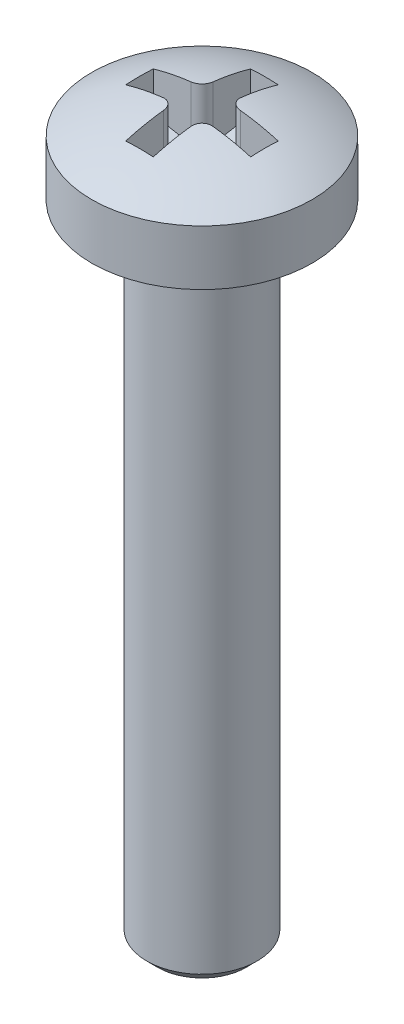
ISO-10303-21;
HEADER;
FILE_DESCRIPTION(('STEP AP214'),'2;1');
FILE_NAME('part.step','',(''),(''),'','','');
FILE_SCHEMA(('AUTOMOTIVE_DESIGN { 1 0 10303 214 1 1 1 1 }'));
ENDSEC;
DATA;
#1=APPLICATION_CONTEXT('core data for automotive mechanical design processes');
#2=APPLICATION_PROTOCOL_DEFINITION('international standard','automotive_design',2000,#1);
#3=PRODUCT_CONTEXT('',#1,'mechanical');
#4=PRODUCT('Part','Part','',(#3));
#5=PRODUCT_RELATED_PRODUCT_CATEGORY('part','',(#4));
#6=PRODUCT_DEFINITION_FORMATION('','',#4);
#7=PRODUCT_DEFINITION_CONTEXT('part definition',#1,'design');
#8=PRODUCT_DEFINITION('design','',#6,#7);
#9=PRODUCT_DEFINITION_SHAPE('','',#8);
#10=(LENGTH_UNIT() NAMED_UNIT(*) SI_UNIT(.MILLI.,.METRE.));
#11=(NAMED_UNIT(*) PLANE_ANGLE_UNIT() SI_UNIT($,.RADIAN.));
#12=(NAMED_UNIT(*) SI_UNIT($,.STERADIAN.) SOLID_ANGLE_UNIT());
#13=UNCERTAINTY_MEASURE_WITH_UNIT(LENGTH_MEASURE(1.E-05),#10,'distance_accuracy_value','');
#14=(GEOMETRIC_REPRESENTATION_CONTEXT(3) GLOBAL_UNCERTAINTY_ASSIGNED_CONTEXT((#13)) GLOBAL_UNIT_ASSIGNED_CONTEXT((#10,
#11,#12)) REPRESENTATION_CONTEXT('',''));
#15=CARTESIAN_POINT('',(0.,0.,0.));
#16=DIRECTION('',(0.,0.,1.));
#17=DIRECTION('',(1.,0.,0.));
#18=AXIS2_PLACEMENT_3D('',#15,#16,#17);
#19=CARTESIAN_POINT('',(3.,-35.,0.));
#20=DIRECTION('',(0.,1.,0.));
#21=DIRECTION('',(0.,0.,1.));
#22=AXIS2_PLACEMENT_3D('',#19,#20,#21);
#23=PLANE('',#22);
#24=CARTESIAN_POINT('',(0.,-35.,0.));
#25=DIRECTION('',(0.,1.,0.));
#26=DIRECTION('',(0.,0.,1.));
#27=AXIS2_PLACEMENT_3D('',#24,#25,#26);
#28=CIRCLE('',#27,2.40000000000001);
#29=CARTESIAN_POINT('',(0.,-35.,2.40000000000001));
#30=VERTEX_POINT('',#29);
#31=EDGE_CURVE('E11',#30,#30,#28,.F.);
#32=ORIENTED_EDGE('',*,*,#31,.T.);
#33=EDGE_LOOP('',(#32));
#34=FACE_BOUND('',#33,.T.);
#35=ADVANCED_FACE('F37',(#34),#23,.F.);
#36=CARTESIAN_POINT('',(0.,-7.44999999999999,0.));
#37=DIRECTION('',(0.,1.,0.));
#38=DIRECTION('',(1.,0.,0.));
#39=AXIS2_PLACEMENT_3D('',#36,#37,#38);
#40=SPHERICAL_SURFACE('',#39,12.05);
#41=CARTESIAN_POINT('',(0.75,-7.44999999999999,0.));
#42=DIRECTION('',(1.,0.,0.));
#43=DIRECTION('',(0.,0.,-1.));
#44=AXIS2_PLACEMENT_3D('',#41,#42,#43);
#45=CIRCLE('',#44,12.0266371026983);
#46=CARTESIAN_POINT('',(0.75,4.08603051313579,-3.4));
#47=VERTEX_POINT('',#46);
#48=CARTESIAN_POINT('',(0.75,4.50062759858243,-1.35));
#49=VERTEX_POINT('',#48);
#50=EDGE_CURVE('E195',#47,#49,#45,.T.);
#51=ORIENTED_EDGE('',*,*,#50,.T.);
#52=CARTESIAN_POINT('',(0.75,4.50062759858243,-1.35));
#53=CARTESIAN_POINT('',(0.749970698872697,4.50440889012492,-1.31655591255039));
#54=CARTESIAN_POINT('',(0.752794798026864,4.50786991911377,-1.28307795509376));
#55=CARTESIAN_POINT('',(0.763975275297831,4.51406552358367,-1.21700468922484));
#56=CARTESIAN_POINT('',(0.772329233355664,4.51680041611411,-1.18440900119309));
#57=CARTESIAN_POINT('',(0.79440353509289,4.52146303861642,-1.12099578071274));
#58=CARTESIAN_POINT('',(0.808127936309649,4.52339015600345,-1.09017961299683));
#59=CARTESIAN_POINT('',(0.840557266614517,4.52637706033217,-1.03125561276694));
#60=CARTESIAN_POINT('',(0.8592606546155,4.52743711523272,-1.00314694589195));
#61=CARTESIAN_POINT('',(0.900979469558403,4.52865432624304,-0.95062827208944));
#62=CARTESIAN_POINT('',(0.923964554523091,4.52881760325255,-0.926194301302964));
#63=CARTESIAN_POINT('',(0.973678414753883,4.52825275812473,-0.881492303520661));
#64=CARTESIAN_POINT('',(1.00040776840153,4.52752449813588,-0.861224921338421));
#65=CARTESIAN_POINT('',(1.05675110369052,4.52520195501556,-0.825485736308251));
#66=CARTESIAN_POINT('',(1.08635633111687,4.52361023640853,-0.809999944511885));
#67=CARTESIAN_POINT('',(1.14767285065154,4.51960909198419,-0.78416498760138));
#68=CARTESIAN_POINT('',(1.17938331676325,4.51719998536419,-0.773813821249108));
#69=CARTESIAN_POINT('',(1.23437039023693,4.51246564112583,-0.760785009950145));
#70=CARTESIAN_POINT('',(1.25734967707357,4.51032865006867,-0.756740661571654));
#71=CARTESIAN_POINT('',(1.30355584224305,4.50572101643025,-0.751347964421718));
#72=CARTESIAN_POINT('',(1.3267823190226,4.50325085589045,-0.749995764296765));
#73=CARTESIAN_POINT('',(1.35,4.50062759858243,-0.75));
#74=B_SPLINE_CURVE_WITH_KNOTS('',3,(#52,#53,#54,#55,#56,#57,#58,#59,#60,#61,#62,#63,#64,#65,#66,
#67,#68,#69,#70,#71,#72,#73),.UNSPECIFIED.,.F.,.F.,(4,2,2,2,2,2,2,2,2,2,4),(0.,
0.100848616189047,0.201653126662501,0.302533945598312,0.403383576314152,0.503544000910255,
0.603719914500104,0.703599915669478,0.803440957613562,0.873581021054327,0.943620670692784),.UNSPECIFIED.);
#75=CARTESIAN_POINT('',(1.35,4.50062759858243,-0.75));
#76=VERTEX_POINT('',#75);
#77=EDGE_CURVE('E257',#49,#76,#74,.T.);
#78=ORIENTED_EDGE('',*,*,#77,.T.);
#79=CARTESIAN_POINT('',(0.,-7.44999999999999,-0.75));
#80=DIRECTION('',(0.,0.,-1.));
#81=DIRECTION('',(-1.,0.,0.));
#82=AXIS2_PLACEMENT_3D('',#79,#80,#81);
#83=CIRCLE('',#82,12.0266371026983);
#84=CARTESIAN_POINT('',(3.4,4.08603051313579,-0.75));
#85=VERTEX_POINT('',#84);
#86=EDGE_CURVE('E193',#76,#85,#83,.T.);
#87=ORIENTED_EDGE('',*,*,#86,.T.);
#88=CARTESIAN_POINT('',(3.4,-7.44999999999999,0.));
#89=DIRECTION('',(1.,0.,0.));
#90=DIRECTION('',(0.,0.,-1.));
#91=AXIS2_PLACEMENT_3D('',#88,#89,#90);
#92=CIRCLE('',#91,11.5603849416877);
#93=CARTESIAN_POINT('',(3.4,4.08603051313579,0.75));
#94=VERTEX_POINT('',#93);
#95=EDGE_CURVE('E170',#85,#94,#92,.T.);
#96=ORIENTED_EDGE('',*,*,#95,.T.);
#97=CARTESIAN_POINT('',(0.,-7.44999999999999,0.75));
#98=DIRECTION('',(0.,0.,1.));
#99=DIRECTION('',(1.,0.,0.));
#100=AXIS2_PLACEMENT_3D('',#97,#98,#99);
#101=CIRCLE('',#100,12.0266371026983);
#102=CARTESIAN_POINT('',(1.35,4.50062759858243,0.75));
#103=VERTEX_POINT('',#102);
#104=EDGE_CURVE('E219',#94,#103,#101,.T.);
#105=ORIENTED_EDGE('',*,*,#104,.T.);
#106=CARTESIAN_POINT('',(1.35,4.50062759858243,0.75));
#107=CARTESIAN_POINT('',(1.31655591255039,4.50440889012492,0.749970698872697));
#108=CARTESIAN_POINT('',(1.28307795509376,4.50786991911377,0.752794798026864));
#109=CARTESIAN_POINT('',(1.21700468922484,4.51406552358367,0.763975275297831));
#110=CARTESIAN_POINT('',(1.18440900119309,4.51680041611411,0.772329233355664));
#111=CARTESIAN_POINT('',(1.12099578071274,4.52146303861642,0.79440353509289));
#112=CARTESIAN_POINT('',(1.09017961299683,4.52339015600345,0.808127936309649));
#113=CARTESIAN_POINT('',(1.03125561276694,4.52637706033217,0.840557266614517));
#114=CARTESIAN_POINT('',(1.00314694589195,4.52743711523272,0.8592606546155));
#115=CARTESIAN_POINT('',(0.95062827208944,4.52865432624304,0.900979469558403));
#116=CARTESIAN_POINT('',(0.926194301302965,4.52881760325255,0.923964554523091));
#117=CARTESIAN_POINT('',(0.881492303520662,4.52825275812473,0.973678414753883));
#118=CARTESIAN_POINT('',(0.861224921338422,4.52752449813588,1.00040776840153));
#119=CARTESIAN_POINT('',(0.825485736308252,4.52520195501556,1.05675110369052));
#120=CARTESIAN_POINT('',(0.809999944511885,4.52361023640853,1.08635633111687));
#121=CARTESIAN_POINT('',(0.784164987601381,4.51960909198419,1.14767285065154));
#122=CARTESIAN_POINT('',(0.773813821249109,4.51719998536419,1.17938331676325));
#123=CARTESIAN_POINT('',(0.760785009950146,4.51246564112583,1.23437039023693));
#124=CARTESIAN_POINT('',(0.756740661571655,4.51032865006867,1.25734967707357));
#125=CARTESIAN_POINT('',(0.751347964421719,4.50572101643025,1.30355584224305));
#126=CARTESIAN_POINT('',(0.749995764296766,4.50325085589045,1.3267823190226));
#127=CARTESIAN_POINT('',(0.750000000000001,4.50062759858243,1.35));
#128=B_SPLINE_CURVE_WITH_KNOTS('',3,(#106,#107,#108,#109,#110,#111,#112,#113,#114,#115,#116,
#117,#118,#119,#120,#121,#122,#123,#124,#125,#126,#127),.UNSPECIFIED.,.F.,.F.,(4,2,2,2,2,2,2,2,
2,2,4),(0.,0.100848616189047,0.201653126662501,0.302533945598312,0.403383576314151,
0.503544000910255,0.603719914500104,0.703599915669478,0.803440957613562,0.873581021054327,
0.943620670692784),.UNSPECIFIED.);
#129=CARTESIAN_POINT('',(0.75,4.50062759858243,1.35));
#130=VERTEX_POINT('',#129);
#131=EDGE_CURVE('E252',#103,#130,#128,.T.);
#132=ORIENTED_EDGE('',*,*,#131,.T.);
#133=CARTESIAN_POINT('',(0.75,-7.44999999999999,0.));
#134=DIRECTION('',(1.,0.,0.));
#135=DIRECTION('',(0.,0.,-1.));
#136=AXIS2_PLACEMENT_3D('',#133,#134,#135);
#137=CIRCLE('',#136,12.0266371026983);
#138=CARTESIAN_POINT('',(0.75,4.08603051313579,3.4));
#139=VERTEX_POINT('',#138);
#140=EDGE_CURVE('E217',#130,#139,#137,.T.);
#141=ORIENTED_EDGE('',*,*,#140,.T.);
#142=CARTESIAN_POINT('',(0.,-7.44999999999999,3.4));
#143=DIRECTION('',(0.,0.,1.));
#144=DIRECTION('',(1.,0.,0.));
#145=AXIS2_PLACEMENT_3D('',#142,#143,#144);
#146=CIRCLE('',#145,11.5603849416877);
#147=CARTESIAN_POINT('',(-0.75,4.08603051313579,3.4));
#148=VERTEX_POINT('',#147);
#149=EDGE_CURVE('E214',#139,#148,#146,.T.);
#150=ORIENTED_EDGE('',*,*,#149,.T.);
#151=CARTESIAN_POINT('',(-0.75,-7.44999999999999,0.));
#152=DIRECTION('',(-1.,0.,0.));
#153=DIRECTION('',(0.,0.,1.));
#154=AXIS2_PLACEMENT_3D('',#151,#152,#153);
#155=CIRCLE('',#154,12.0266371026983);
#156=CARTESIAN_POINT('',(-0.75,4.50062759858243,1.35));
#157=VERTEX_POINT('',#156);
#158=EDGE_CURVE('E211',#148,#157,#155,.T.);
#159=ORIENTED_EDGE('',*,*,#158,.T.);
#160=CARTESIAN_POINT('',(-0.75,4.50062759858243,1.35));
#161=CARTESIAN_POINT('',(-0.749970698872696,4.50440889012492,1.31655591255039));
#162=CARTESIAN_POINT('',(-0.752794798026864,4.50786991911377,1.28307795509376));
#163=CARTESIAN_POINT('',(-0.763975275297831,4.51406552358367,1.21700468922484));
#164=CARTESIAN_POINT('',(-0.772329233355664,4.51680041611411,1.18440900119309));
#165=CARTESIAN_POINT('',(-0.794403535092889,4.52146303861642,1.12099578071274));
#166=CARTESIAN_POINT('',(-0.808127936309649,4.52339015600345,1.09017961299683));
#167=CARTESIAN_POINT('',(-0.840557266614517,4.52637706033217,1.03125561276694));
#168=CARTESIAN_POINT('',(-0.8592606546155,4.52743711523272,1.00314694589195));
#169=CARTESIAN_POINT('',(-0.900979469558402,4.52865432624304,0.95062827208944));
#170=CARTESIAN_POINT('',(-0.923964554523091,4.52881760325255,0.926194301302964));
#171=CARTESIAN_POINT('',(-0.973678414753883,4.52825275812473,0.881492303520661));
#172=CARTESIAN_POINT('',(-1.00040776840153,4.52752449813588,0.861224921338422));
#173=CARTESIAN_POINT('',(-1.05675110369052,4.52520195501556,0.825485736308252));
#174=CARTESIAN_POINT('',(-1.08635633111687,4.52361023640853,0.809999944511885));
#175=CARTESIAN_POINT('',(-1.14767285065154,4.51960909198419,0.78416498760138));
#176=CARTESIAN_POINT('',(-1.17938331676325,4.51719998536419,0.773813821249109));
#177=CARTESIAN_POINT('',(-1.23437039023693,4.51246564112583,0.760785009950145));
#178=CARTESIAN_POINT('',(-1.25734967707357,4.51032865006867,0.756740661571655));
#179=CARTESIAN_POINT('',(-1.30355584224305,4.50572101643025,0.751347964421718));
#180=CARTESIAN_POINT('',(-1.3267823190226,4.50325085589045,0.749995764296765));
#181=CARTESIAN_POINT('',(-1.35,4.50062759858243,0.75));
#182=B_SPLINE_CURVE_WITH_KNOTS('',3,(#160,#161,#162,#163,#164,#165,#166,#167,#168,#169,#170,
#171,#172,#173,#174,#175,#176,#177,#178,#179,#180,#181),.UNSPECIFIED.,.F.,.F.,(4,2,2,2,2,2,2,2,
2,2,4),(0.,0.100848616189047,0.201653126662501,0.302533945598312,0.403383576314152,
0.503544000910255,0.603719914500104,0.703599915669478,0.803440957613562,0.873581021054327,
0.943620670692784),.UNSPECIFIED.);
#183=CARTESIAN_POINT('',(-1.35,4.50062759858243,0.75));
#184=VERTEX_POINT('',#183);
#185=EDGE_CURVE('E231',#157,#184,#182,.T.);
#186=ORIENTED_EDGE('',*,*,#185,.T.);
#187=CARTESIAN_POINT('',(0.,-7.44999999999999,0.75));
#188=DIRECTION('',(0.,0.,1.));
#189=DIRECTION('',(1.,0.,0.));
#190=AXIS2_PLACEMENT_3D('',#187,#188,#189);
#191=CIRCLE('',#190,12.0266371026983);
#192=CARTESIAN_POINT('',(-3.4,4.08603051313579,0.75));
#193=VERTEX_POINT('',#192);
#194=EDGE_CURVE('E209',#184,#193,#191,.T.);
#195=ORIENTED_EDGE('',*,*,#194,.T.);
#196=CARTESIAN_POINT('',(-3.4,-7.44999999999999,0.));
#197=DIRECTION('',(-1.,0.,0.));
#198=DIRECTION('',(0.,0.,1.));
#199=AXIS2_PLACEMENT_3D('',#196,#197,#198);
#200=CIRCLE('',#199,11.5603849416877);
#201=CARTESIAN_POINT('',(-3.4,4.08603051313579,-0.75));
#202=VERTEX_POINT('',#201);
#203=EDGE_CURVE('E206',#193,#202,#200,.T.);
#204=ORIENTED_EDGE('',*,*,#203,.T.);
#205=CARTESIAN_POINT('',(0.,-7.44999999999999,-0.75));
#206=DIRECTION('',(0.,0.,-1.));
#207=DIRECTION('',(-1.,0.,0.));
#208=AXIS2_PLACEMENT_3D('',#205,#206,#207);
#209=CIRCLE('',#208,12.0266371026983);
#210=CARTESIAN_POINT('',(-1.35,4.50062759858243,-0.75));
#211=VERTEX_POINT('',#210);
#212=EDGE_CURVE('E203',#202,#211,#209,.T.);
#213=ORIENTED_EDGE('',*,*,#212,.T.);
#214=CARTESIAN_POINT('',(-1.35,4.50062759858243,-0.75));
#215=CARTESIAN_POINT('',(-1.31655591255039,4.50440889012492,-0.749970698872696));
#216=CARTESIAN_POINT('',(-1.28307795509376,4.50786991911377,-0.752794798026864));
#217=CARTESIAN_POINT('',(-1.21700468922484,4.51406552358367,-0.763975275297831));
#218=CARTESIAN_POINT('',(-1.18440900119309,4.51680041611411,-0.772329233355664));
#219=CARTESIAN_POINT('',(-1.12099578071274,4.52146303861642,-0.794403535092889));
#220=CARTESIAN_POINT('',(-1.09017961299683,4.52339015600345,-0.808127936309649));
#221=CARTESIAN_POINT('',(-1.03125561276694,4.52637706033217,-0.840557266614517));
#222=CARTESIAN_POINT('',(-1.00314694589195,4.52743711523272,-0.8592606546155));
#223=CARTESIAN_POINT('',(-0.95062827208944,4.52865432624304,-0.900979469558402));
#224=CARTESIAN_POINT('',(-0.926194301302964,4.52881760325255,-0.923964554523091));
#225=CARTESIAN_POINT('',(-0.881492303520661,4.52825275812473,-0.973678414753883));
#226=CARTESIAN_POINT('',(-0.861224921338422,4.52752449813588,-1.00040776840153));
#227=CARTESIAN_POINT('',(-0.825485736308252,4.52520195501556,-1.05675110369052));
#228=CARTESIAN_POINT('',(-0.809999944511885,4.52361023640853,-1.08635633111687));
#229=CARTESIAN_POINT('',(-0.78416498760138,4.51960909198419,-1.14767285065154));
#230=CARTESIAN_POINT('',(-0.773813821249109,4.51719998536419,-1.17938331676325));
#231=CARTESIAN_POINT('',(-0.760785009950145,4.51246564112583,-1.23437039023693));
#232=CARTESIAN_POINT('',(-0.756740661571655,4.51032865006867,-1.25734967707357));
#233=CARTESIAN_POINT('',(-0.751347964421718,4.50572101643025,-1.30355584224305));
#234=CARTESIAN_POINT('',(-0.749995764296765,4.50325085589045,-1.3267823190226));
#235=CARTESIAN_POINT('',(-0.75,4.50062759858243,-1.35));
#236=B_SPLINE_CURVE_WITH_KNOTS('',3,(#214,#215,#216,#217,#218,#219,#220,#221,#222,#223,#224,
#225,#226,#227,#228,#229,#230,#231,#232,#233,#234,#235),.UNSPECIFIED.,.F.,.F.,(4,2,2,2,2,2,2,2,
2,2,4),(0.,0.100848616189047,0.201653126662501,0.302533945598312,0.403383576314151,
0.503544000910255,0.603719914500104,0.703599915669478,0.803440957613562,0.873581021054327,
0.943620670692784),.UNSPECIFIED.);
#237=CARTESIAN_POINT('',(-0.75,4.50062759858243,-1.35));
#238=VERTEX_POINT('',#237);
#239=EDGE_CURVE('E225',#211,#238,#236,.T.);
#240=ORIENTED_EDGE('',*,*,#239,.T.);
#241=CARTESIAN_POINT('',(-0.75,-7.44999999999999,0.));
#242=DIRECTION('',(-1.,0.,0.));
#243=DIRECTION('',(0.,0.,1.));
#244=AXIS2_PLACEMENT_3D('',#241,#242,#243);
#245=CIRCLE('',#244,12.0266371026983);
#246=CARTESIAN_POINT('',(-0.75,4.08603051313579,-3.4));
#247=VERTEX_POINT('',#246);
#248=EDGE_CURVE('E201',#238,#247,#245,.T.);
#249=ORIENTED_EDGE('',*,*,#248,.T.);
#250=CARTESIAN_POINT('',(0.,-7.44999999999999,-3.4));
#251=DIRECTION('',(0.,0.,-1.));
#252=DIRECTION('',(-1.,0.,0.));
#253=AXIS2_PLACEMENT_3D('',#250,#251,#252);
#254=CIRCLE('',#253,11.5603849416877);
#255=EDGE_CURVE('E198',#247,#47,#254,.T.);
#256=ORIENTED_EDGE('',*,*,#255,.T.);
#257=EDGE_LOOP('',(#51,#78,#87,#96,#105,#132,#141,#150,#159,#186,#195,#204,#213,#240,#249,#256));
#258=FACE_BOUND('',#257,.T.);
#259=CARTESIAN_POINT('',(0.,3.,0.));
#260=DIRECTION('',(0.,1.,0.));
#261=DIRECTION('',(0.,0.,1.));
#262=AXIS2_PLACEMENT_3D('',#259,#260,#261);
#263=CIRCLE('',#262,6.);
#264=CARTESIAN_POINT('',(0.,3.,6.));
#265=VERTEX_POINT('',#264);
#266=EDGE_CURVE('E189',#265,#265,#263,.T.);
#267=ORIENTED_EDGE('',*,*,#266,.T.);
#268=EDGE_LOOP('',(#267));
#269=FACE_BOUND('',#268,.T.);
#270=ADVANCED_FACE('F239',(#258,#269),#40,.T.);
#271=CARTESIAN_POINT('',(0.,4.6,0.));
#272=DIRECTION('',(0.,1.,0.));
#273=DIRECTION('',(0.,0.,1.));
#274=AXIS2_PLACEMENT_3D('',#271,#272,#273);
#275=CYLINDRICAL_SURFACE('',#274,6.);
#276=ORIENTED_EDGE('',*,*,#266,.F.);
#277=EDGE_LOOP('',(#276));
#278=FACE_BOUND('',#277,.T.);
#279=CARTESIAN_POINT('',(0.,0.,0.));
#280=DIRECTION('',(0.,1.,0.));
#281=DIRECTION('',(0.,0.,1.));
#282=AXIS2_PLACEMENT_3D('',#279,#280,#281);
#283=CIRCLE('',#282,6.);
#284=CARTESIAN_POINT('',(0.,0.,6.));
#285=VERTEX_POINT('',#284);
#286=EDGE_CURVE('E181',#285,#285,#283,.T.);
#287=ORIENTED_EDGE('',*,*,#286,.T.);
#288=EDGE_LOOP('',(#287));
#289=FACE_BOUND('',#288,.T.);
#290=ADVANCED_FACE('F244',(#278,#289),#275,.T.);
#291=CARTESIAN_POINT('',(6.,0.,0.));
#292=DIRECTION('',(0.,1.,0.));
#293=DIRECTION('',(0.,0.,1.));
#294=AXIS2_PLACEMENT_3D('',#291,#292,#293);
#295=PLANE('',#294);
#296=ORIENTED_EDGE('',*,*,#286,.F.);
#297=EDGE_LOOP('',(#296));
#298=FACE_BOUND('',#297,.T.);
#299=CARTESIAN_POINT('',(0.,0.,0.));
#300=DIRECTION('',(0.,1.,0.));
#301=DIRECTION('',(0.,0.,1.));
#302=AXIS2_PLACEMENT_3D('',#299,#300,#301);
#303=CIRCLE('',#302,3.);
#304=CARTESIAN_POINT('',(0.,0.,3.));
#305=VERTEX_POINT('',#304);
#306=EDGE_CURVE('E178',#305,#305,#303,.T.);
#307=ORIENTED_EDGE('',*,*,#306,.T.);
#308=EDGE_LOOP('',(#307));
#309=FACE_BOUND('',#308,.T.);
#310=ADVANCED_FACE('F331',(#298,#309),#295,.F.);
#311=CARTESIAN_POINT('',(0.,4.6,0.));
#312=DIRECTION('',(0.,1.,0.));
#313=DIRECTION('',(0.,0.,1.));
#314=AXIS2_PLACEMENT_3D('',#311,#312,#313);
#315=CYLINDRICAL_SURFACE('',#314,3.);
#316=CARTESIAN_POINT('',(0.,-34.4,0.));
#317=DIRECTION('',(0.,1.,0.));
#318=DIRECTION('',(0.,0.,1.));
#319=AXIS2_PLACEMENT_3D('',#316,#317,#318);
#320=CIRCLE('',#319,3.);
#321=CARTESIAN_POINT('',(0.,-34.4,3.));
#322=VERTEX_POINT('',#321);
#323=EDGE_CURVE('E45',#322,#322,#320,.T.);
#324=ORIENTED_EDGE('',*,*,#323,.T.);
#325=EDGE_LOOP('',(#324));
#326=FACE_BOUND('',#325,.T.);
#327=ORIENTED_EDGE('',*,*,#306,.F.);
#328=EDGE_LOOP('',(#327));
#329=FACE_BOUND('',#328,.T.);
#330=ADVANCED_FACE('F303',(#326,#329),#315,.T.);
#331=CARTESIAN_POINT('',(0.75,-35.001,0.75));
#332=DIRECTION('',(0.,0.,1.));
#333=DIRECTION('',(1.,0.,0.));
#334=AXIS2_PLACEMENT_3D('',#331,#332,#333);
#335=PLANE('',#334);
#336=CARTESIAN_POINT('',(0.,14.25,0.75));
#337=DIRECTION('',(0.,0.,1.));
#338=DIRECTION('',(1.,0.,0.));
#339=AXIS2_PLACEMENT_3D('',#336,#337,#338);
#340=CIRCLE('',#339,12.7279220613579);
#341=CARTESIAN_POINT('',(3.4,1.98460151483043,0.75));
#342=VERTEX_POINT('',#341);
#343=CARTESIAN_POINT('',(1.35,1.59387500061729,0.75));
#344=VERTEX_POINT('',#343);
#345=EDGE_CURVE('E176',#342,#344,#340,.F.);
#346=ORIENTED_EDGE('',*,*,#345,.T.);
#347=DIRECTION('',(0.,1.,0.));
#348=VECTOR('',#347,1.);
#349=CARTESIAN_POINT('',(1.35,-35.001,0.75));
#350=LINE('',#349,#348);
#351=EDGE_CURVE('E556',#344,#103,#350,.T.);
#352=ORIENTED_EDGE('',*,*,#351,.T.);
#353=ORIENTED_EDGE('',*,*,#104,.F.);
#354=DIRECTION('',(0.,1.,0.));
#355=VECTOR('',#354,1.);
#356=CARTESIAN_POINT('',(3.4,-35.001,0.75));
#357=LINE('',#356,#355);
#358=EDGE_CURVE('E172',#342,#94,#357,.T.);
#359=ORIENTED_EDGE('',*,*,#358,.F.);
#360=EDGE_LOOP('',(#346,#352,#353,#359));
#361=FACE_BOUND('',#360,.T.);
#362=ADVANCED_FACE('F344',(#361),#335,.F.);
#363=CARTESIAN_POINT('',(0.75,-35.001,0.75));
#364=DIRECTION('',(1.,0.,0.));
#365=DIRECTION('',(0.,0.,-1.));
#366=AXIS2_PLACEMENT_3D('',#363,#364,#365);
#367=PLANE('',#366);
#368=ORIENTED_EDGE('',*,*,#140,.F.);
#369=DIRECTION('',(0.,1.,0.));
#370=VECTOR('',#369,1.);
#371=CARTESIAN_POINT('',(0.75,-35.001,1.35));
#372=LINE('',#371,#370);
#373=CARTESIAN_POINT('',(0.75,1.59387500061729,1.35));
#374=VERTEX_POINT('',#373);
#375=EDGE_CURVE('E554',#130,#374,#372,.F.);
#376=ORIENTED_EDGE('',*,*,#375,.T.);
#377=CARTESIAN_POINT('',(0.75,14.25,0.));
#378=DIRECTION('',(1.,0.,0.));
#379=DIRECTION('',(0.,0.,-1.));
#380=AXIS2_PLACEMENT_3D('',#377,#378,#379);
#381=CIRCLE('',#380,12.7279220613579);
#382=CARTESIAN_POINT('',(0.75,1.98460151483043,3.4));
#383=VERTEX_POINT('',#382);
#384=EDGE_CURVE('E183',#374,#383,#381,.F.);
#385=ORIENTED_EDGE('',*,*,#384,.T.);
#386=DIRECTION('',(0.,1.,0.));
#387=VECTOR('',#386,1.);
#388=CARTESIAN_POINT('',(0.750000000000001,-35.001,3.4));
#389=LINE('',#388,#387);
#390=EDGE_CURVE('E162',#383,#139,#389,.T.);
#391=ORIENTED_EDGE('',*,*,#390,.T.);
#392=EDGE_LOOP('',(#368,#376,#385,#391));
#393=FACE_BOUND('',#392,.T.);
#394=ADVANCED_FACE('F292',(#393),#367,.F.);
#395=CARTESIAN_POINT('',(-0.75,-35.001,3.4));
#396=DIRECTION('',(0.,0.,1.));
#397=DIRECTION('',(1.,0.,0.));
#398=AXIS2_PLACEMENT_3D('',#395,#396,#397);
#399=PLANE('',#398);
#400=ORIENTED_EDGE('',*,*,#390,.F.);
#401=CARTESIAN_POINT('',(0.,14.25,3.4));
#402=DIRECTION('',(0.,0.,1.));
#403=DIRECTION('',(1.,0.,0.));
#404=AXIS2_PLACEMENT_3D('',#401,#402,#403);
#405=CIRCLE('',#404,12.2883074505808);
#406=CARTESIAN_POINT('',(-0.75,1.98460151483043,3.4));
#407=VERTEX_POINT('',#406);
#408=EDGE_CURVE('E518',#383,#407,#405,.F.);
#409=ORIENTED_EDGE('',*,*,#408,.T.);
#410=DIRECTION('',(0.,1.,0.));
#411=VECTOR('',#410,1.);
#412=CARTESIAN_POINT('',(-0.75,-35.001,3.4));
#413=LINE('',#412,#411);
#414=EDGE_CURVE('E517',#407,#148,#413,.T.);
#415=ORIENTED_EDGE('',*,*,#414,.T.);
#416=ORIENTED_EDGE('',*,*,#149,.F.);
#417=EDGE_LOOP('',(#400,#409,#415,#416));
#418=FACE_BOUND('',#417,.T.);
#419=ADVANCED_FACE('F357',(#418),#399,.F.);
#420=CARTESIAN_POINT('',(-0.75,-35.001,0.75));
#421=DIRECTION('',(-1.,0.,0.));
#422=DIRECTION('',(0.,0.,1.));
#423=AXIS2_PLACEMENT_3D('',#420,#421,#422);
#424=PLANE('',#423);
#425=CARTESIAN_POINT('',(-0.75,14.25,0.));
#426=DIRECTION('',(-1.,0.,0.));
#427=DIRECTION('',(0.,0.,1.));
#428=AXIS2_PLACEMENT_3D('',#425,#426,#427);
#429=CIRCLE('',#428,12.7279220613579);
#430=CARTESIAN_POINT('',(-0.75,1.59387500061729,1.35));
#431=VERTEX_POINT('',#430);
#432=EDGE_CURVE('E512',#407,#431,#429,.F.);
#433=ORIENTED_EDGE('',*,*,#432,.T.);
#434=DIRECTION('',(0.,1.,0.));
#435=VECTOR('',#434,1.);
#436=CARTESIAN_POINT('',(-0.75,-35.001,1.35));
#437=LINE('',#436,#435);
#438=EDGE_CURVE('E507',#431,#157,#437,.T.);
#439=ORIENTED_EDGE('',*,*,#438,.T.);
#440=ORIENTED_EDGE('',*,*,#158,.F.);
#441=ORIENTED_EDGE('',*,*,#414,.F.);
#442=EDGE_LOOP('',(#433,#439,#440,#441));
#443=FACE_BOUND('',#442,.T.);
#444=ADVANCED_FACE('F364',(#443),#424,.F.);
#445=CARTESIAN_POINT('',(-3.4,-35.001,0.75));
#446=DIRECTION('',(0.,0.,1.));
#447=DIRECTION('',(1.,0.,0.));
#448=AXIS2_PLACEMENT_3D('',#445,#446,#447);
#449=PLANE('',#448);
#450=ORIENTED_EDGE('',*,*,#194,.F.);
#451=DIRECTION('',(0.,1.,0.));
#452=VECTOR('',#451,1.);
#453=CARTESIAN_POINT('',(-1.35,-35.001,0.75));
#454=LINE('',#453,#452);
#455=CARTESIAN_POINT('',(-1.35,1.59387500061729,0.75));
#456=VERTEX_POINT('',#455);
#457=EDGE_CURVE('E505',#184,#456,#454,.F.);
#458=ORIENTED_EDGE('',*,*,#457,.T.);
#459=CARTESIAN_POINT('',(0.,14.25,0.75));
#460=DIRECTION('',(0.,0.,1.));
#461=DIRECTION('',(1.,0.,0.));
#462=AXIS2_PLACEMENT_3D('',#459,#460,#461);
#463=CIRCLE('',#462,12.7279220613579);
#464=CARTESIAN_POINT('',(-3.4,1.98460151483043,0.75));
#465=VERTEX_POINT('',#464);
#466=EDGE_CURVE('E515',#456,#465,#463,.F.);
#467=ORIENTED_EDGE('',*,*,#466,.T.);
#468=DIRECTION('',(0.,1.,0.));
#469=VECTOR('',#468,1.);
#470=CARTESIAN_POINT('',(-3.4,-35.001,0.75));
#471=LINE('',#470,#469);
#472=EDGE_CURVE('E529',#465,#193,#471,.T.);
#473=ORIENTED_EDGE('',*,*,#472,.T.);
#474=EDGE_LOOP('',(#450,#458,#467,#473));
#475=FACE_BOUND('',#474,.T.);
#476=ADVANCED_FACE('F371',(#475),#449,.F.);
#477=CARTESIAN_POINT('',(-3.4,-35.001,-0.75));
#478=DIRECTION('',(-1.,0.,0.));
#479=DIRECTION('',(0.,0.,1.));
#480=AXIS2_PLACEMENT_3D('',#477,#478,#479);
#481=PLANE('',#480);
#482=ORIENTED_EDGE('',*,*,#472,.F.);
#483=CARTESIAN_POINT('',(-3.4,14.25,0.));
#484=DIRECTION('',(-1.,0.,0.));
#485=DIRECTION('',(0.,0.,1.));
#486=AXIS2_PLACEMENT_3D('',#483,#484,#485);
#487=CIRCLE('',#486,12.2883074505808);
#488=CARTESIAN_POINT('',(-3.4,1.98460151483043,-0.75));
#489=VERTEX_POINT('',#488);
#490=EDGE_CURVE('E521',#465,#489,#487,.F.);
#491=ORIENTED_EDGE('',*,*,#490,.T.);
#492=DIRECTION('',(0.,1.,0.));
#493=VECTOR('',#492,1.);
#494=CARTESIAN_POINT('',(-3.4,-35.001,-0.75));
#495=LINE('',#494,#493);
#496=EDGE_CURVE('E532',#489,#202,#495,.T.);
#497=ORIENTED_EDGE('',*,*,#496,.T.);
#498=ORIENTED_EDGE('',*,*,#203,.F.);
#499=EDGE_LOOP('',(#482,#491,#497,#498));
#500=FACE_BOUND('',#499,.T.);
#501=ADVANCED_FACE('F379',(#500),#481,.F.);
#502=CARTESIAN_POINT('',(-3.4,-35.001,-0.75));
#503=DIRECTION('',(0.,0.,-1.));
#504=DIRECTION('',(-1.,0.,0.));
#505=AXIS2_PLACEMENT_3D('',#502,#503,#504);
#506=PLANE('',#505);
#507=CARTESIAN_POINT('',(0.,14.25,-0.75));
#508=DIRECTION('',(0.,0.,-1.));
#509=DIRECTION('',(-1.,0.,0.));
#510=AXIS2_PLACEMENT_3D('',#507,#508,#509);
#511=CIRCLE('',#510,12.7279220613579);
#512=CARTESIAN_POINT('',(-1.35,1.59387500061729,-0.75));
#513=VERTEX_POINT('',#512);
#514=EDGE_CURVE('E564',#489,#513,#511,.F.);
#515=ORIENTED_EDGE('',*,*,#514,.T.);
#516=DIRECTION('',(0.,1.,0.));
#517=VECTOR('',#516,1.);
#518=CARTESIAN_POINT('',(-1.35,-35.001,-0.75));
#519=LINE('',#518,#517);
#520=EDGE_CURVE('E549',#513,#211,#519,.T.);
#521=ORIENTED_EDGE('',*,*,#520,.T.);
#522=ORIENTED_EDGE('',*,*,#212,.F.);
#523=ORIENTED_EDGE('',*,*,#496,.F.);
#524=EDGE_LOOP('',(#515,#521,#522,#523));
#525=FACE_BOUND('',#524,.T.);
#526=ADVANCED_FACE('F387',(#525),#506,.F.);
#527=CARTESIAN_POINT('',(-0.75,-35.001,-3.4));
#528=DIRECTION('',(-1.,0.,0.));
#529=DIRECTION('',(0.,0.,1.));
#530=AXIS2_PLACEMENT_3D('',#527,#528,#529);
#531=PLANE('',#530);
#532=ORIENTED_EDGE('',*,*,#248,.F.);
#533=DIRECTION('',(0.,1.,0.));
#534=VECTOR('',#533,1.);
#535=CARTESIAN_POINT('',(-0.75,-35.001,-1.35));
#536=LINE('',#535,#534);
#537=CARTESIAN_POINT('',(-0.75,1.59387500061729,-1.35));
#538=VERTEX_POINT('',#537);
#539=EDGE_CURVE('E52',#238,#538,#536,.F.);
#540=ORIENTED_EDGE('',*,*,#539,.T.);
#541=CARTESIAN_POINT('',(-0.75,14.25,0.));
#542=DIRECTION('',(-1.,0.,0.));
#543=DIRECTION('',(0.,0.,1.));
#544=AXIS2_PLACEMENT_3D('',#541,#542,#543);
#545=CIRCLE('',#544,12.7279220613579);
#546=CARTESIAN_POINT('',(-0.75,1.98460151483043,-3.4));
#547=VERTEX_POINT('',#546);
#548=EDGE_CURVE('E560',#538,#547,#545,.F.);
#549=ORIENTED_EDGE('',*,*,#548,.T.);
#550=DIRECTION('',(0.,1.,0.));
#551=VECTOR('',#550,1.);
#552=CARTESIAN_POINT('',(-0.75,-35.001,-3.4));
#553=LINE('',#552,#551);
#554=EDGE_CURVE('E535',#547,#247,#553,.T.);
#555=ORIENTED_EDGE('',*,*,#554,.T.);
#556=EDGE_LOOP('',(#532,#540,#549,#555));
#557=FACE_BOUND('',#556,.T.);
#558=ADVANCED_FACE('F395',(#557),#531,.F.);
#559=CARTESIAN_POINT('',(-0.75,-35.001,-3.4));
#560=DIRECTION('',(0.,0.,-1.));
#561=DIRECTION('',(-1.,0.,0.));
#562=AXIS2_PLACEMENT_3D('',#559,#560,#561);
#563=PLANE('',#562);
#564=ORIENTED_EDGE('',*,*,#554,.F.);
#565=CARTESIAN_POINT('',(0.,14.25,-3.4));
#566=DIRECTION('',(0.,0.,-1.));
#567=DIRECTION('',(-1.,0.,0.));
#568=AXIS2_PLACEMENT_3D('',#565,#566,#567);
#569=CIRCLE('',#568,12.2883074505808);
#570=CARTESIAN_POINT('',(0.75,1.98460151483043,-3.4));
#571=VERTEX_POINT('',#570);
#572=EDGE_CURVE('E543',#547,#571,#569,.F.);
#573=ORIENTED_EDGE('',*,*,#572,.T.);
#574=DIRECTION('',(0.,1.,0.));
#575=VECTOR('',#574,1.);
#576=CARTESIAN_POINT('',(0.75,-35.001,-3.4));
#577=LINE('',#576,#575);
#578=EDGE_CURVE('E171',#571,#47,#577,.T.);
#579=ORIENTED_EDGE('',*,*,#578,.T.);
#580=ORIENTED_EDGE('',*,*,#255,.F.);
#581=EDGE_LOOP('',(#564,#573,#579,#580));
#582=FACE_BOUND('',#581,.T.);
#583=ADVANCED_FACE('F403',(#582),#563,.F.);
#584=CARTESIAN_POINT('',(0.75,-35.001,-3.4));
#585=DIRECTION('',(1.,0.,0.));
#586=DIRECTION('',(0.,0.,-1.));
#587=AXIS2_PLACEMENT_3D('',#584,#585,#586);
#588=PLANE('',#587);
#589=CARTESIAN_POINT('',(0.75,14.25,0.));
#590=DIRECTION('',(1.,0.,0.));
#591=DIRECTION('',(0.,0.,-1.));
#592=AXIS2_PLACEMENT_3D('',#589,#590,#591);
#593=CIRCLE('',#592,12.7279220613579);
#594=CARTESIAN_POINT('',(0.75,1.59387500061729,-1.35));
#595=VERTEX_POINT('',#594);
#596=EDGE_CURVE('E161',#571,#595,#593,.F.);
#597=ORIENTED_EDGE('',*,*,#596,.T.);
#598=DIRECTION('',(0.,1.,0.));
#599=VECTOR('',#598,1.);
#600=CARTESIAN_POINT('',(0.75,-35.001,-1.35));
#601=LINE('',#600,#599);
#602=EDGE_CURVE('E222',#595,#49,#601,.T.);
#603=ORIENTED_EDGE('',*,*,#602,.T.);
#604=ORIENTED_EDGE('',*,*,#50,.F.);
#605=ORIENTED_EDGE('',*,*,#578,.F.);
#606=EDGE_LOOP('',(#597,#603,#604,#605));
#607=FACE_BOUND('',#606,.T.);
#608=ADVANCED_FACE('F410',(#607),#588,.F.);
#609=CARTESIAN_POINT('',(0.75,-35.001,-0.75));
#610=DIRECTION('',(0.,0.,-1.));
#611=DIRECTION('',(-1.,0.,0.));
#612=AXIS2_PLACEMENT_3D('',#609,#610,#611);
#613=PLANE('',#612);
#614=ORIENTED_EDGE('',*,*,#86,.F.);
#615=DIRECTION('',(0.,1.,0.));
#616=VECTOR('',#615,1.);
#617=CARTESIAN_POINT('',(1.35,-35.001,-0.75));
#618=LINE('',#617,#616);
#619=CARTESIAN_POINT('',(1.35,1.59387500061729,-0.75));
#620=VERTEX_POINT('',#619);
#621=EDGE_CURVE('E158',#76,#620,#618,.F.);
#622=ORIENTED_EDGE('',*,*,#621,.T.);
#623=CARTESIAN_POINT('',(0.,14.25,-0.75));
#624=DIRECTION('',(0.,0.,-1.));
#625=DIRECTION('',(-1.,0.,0.));
#626=AXIS2_PLACEMENT_3D('',#623,#624,#625);
#627=CIRCLE('',#626,12.7279220613579);
#628=CARTESIAN_POINT('',(3.4,1.98460151483043,-0.75));
#629=VERTEX_POINT('',#628);
#630=EDGE_CURVE('E152',#620,#629,#627,.F.);
#631=ORIENTED_EDGE('',*,*,#630,.T.);
#632=DIRECTION('',(0.,1.,0.));
#633=VECTOR('',#632,1.);
#634=CARTESIAN_POINT('',(3.4,-35.001,-0.75));
#635=LINE('',#634,#633);
#636=EDGE_CURVE('E156',#629,#85,#635,.T.);
#637=ORIENTED_EDGE('',*,*,#636,.T.);
#638=EDGE_LOOP('',(#614,#622,#631,#637));
#639=FACE_BOUND('',#638,.T.);
#640=ADVANCED_FACE('F155',(#639),#613,.F.);
#641=CARTESIAN_POINT('',(3.4,-35.001,-0.75));
#642=DIRECTION('',(1.,0.,0.));
#643=DIRECTION('',(0.,0.,-1.));
#644=AXIS2_PLACEMENT_3D('',#641,#642,#643);
#645=PLANE('',#644);
#646=ORIENTED_EDGE('',*,*,#636,.F.);
#647=CARTESIAN_POINT('',(3.4,14.25,0.));
#648=DIRECTION('',(1.,0.,0.));
#649=DIRECTION('',(0.,0.,-1.));
#650=AXIS2_PLACEMENT_3D('',#647,#648,#649);
#651=CIRCLE('',#650,12.2883074505808);
#652=EDGE_CURVE('E167',#629,#342,#651,.F.);
#653=ORIENTED_EDGE('',*,*,#652,.T.);
#654=ORIENTED_EDGE('',*,*,#358,.T.);
#655=ORIENTED_EDGE('',*,*,#95,.F.);
#656=EDGE_LOOP('',(#646,#653,#654,#655));
#657=FACE_BOUND('',#656,.T.);
#658=ADVANCED_FACE('F166',(#657),#645,.F.);
#659=CARTESIAN_POINT('',(0.,14.25,0.));
#660=DIRECTION('',(0.,1.,0.));
#661=DIRECTION('',(1.,0.,0.));
#662=AXIS2_PLACEMENT_3D('',#659,#660,#661);
#663=SPHERICAL_SURFACE('',#662,12.75);
#664=ORIENTED_EDGE('',*,*,#345,.F.);
#665=ORIENTED_EDGE('',*,*,#652,.F.);
#666=ORIENTED_EDGE('',*,*,#630,.F.);
#667=CARTESIAN_POINT('',(1.35,1.59387500061729,-0.75));
#668=CARTESIAN_POINT('',(1.31652284276487,1.5903009687478,-0.749970759566994));
#669=CARTESIAN_POINT('',(1.28301630859104,1.58703022329779,-0.75280030485887));
#670=CARTESIAN_POINT('',(1.21689629455382,1.58117634751904,-0.763998510709715));
#671=CARTESIAN_POINT('',(1.18428239823363,1.57859289145738,-0.772364540735062));
#672=CARTESIAN_POINT('',(1.1208428343835,1.57418949071826,-0.794465603435682));
#673=CARTESIAN_POINT('',(1.09001848505085,1.57237010286254,-0.808204537631822));
#674=CARTESIAN_POINT('',(1.03108477880871,1.56955119561983,-0.840663420524428));
#675=CARTESIAN_POINT('',(1.00297462422337,1.56855143470135,-0.859381899670171));
#676=CARTESIAN_POINT('',(0.950438594465174,1.56740474177465,-0.901145792445529));
#677=CARTESIAN_POINT('',(0.925991261890409,1.5672526373452,-0.924164075342866));
#678=CARTESIAN_POINT('',(0.88127195656644,1.5677919591332,-0.973949998329832));
#679=CARTESIAN_POINT('',(0.861000648126992,1.56848351943744,-1.00071823381491));
#680=CARTESIAN_POINT('',(0.825257480659141,1.57068657827399,-1.05715450170529));
#681=CARTESIAN_POINT('',(0.809773233931137,1.5721959321922,-1.08681478379343));
#682=CARTESIAN_POINT('',(0.783956970189638,1.5759891242147,-1.14824743584145));
#683=CARTESIAN_POINT('',(0.773622839413773,1.5782726439304,-1.18001893321699));
#684=CARTESIAN_POINT('',(0.760675437318296,1.58274689944988,-1.23495502524634));
#685=CARTESIAN_POINT('',(0.756672447980788,1.5847569252076,-1.25781739269588));
#686=CARTESIAN_POINT('',(0.751334599337756,1.58908885387147,-1.30378896965228));
#687=CARTESIAN_POINT('',(0.749995931320883,1.59141030650711,-1.32689777925083));
#688=CARTESIAN_POINT('',(0.75,1.59387500061729,-1.35));
#689=B_SPLINE_CURVE_WITH_KNOTS('',3,(#667,#668,#669,#670,#671,#672,#673,#674,#675,#676,#677,
#678,#679,#680,#681,#682,#683,#684,#685,#686,#687,#688),.UNSPECIFIED.,.F.,.F.,(4,2,2,2,2,2,2,2,
2,2,4),(0.,0.100878068713852,0.201708241907484,0.302611769037313,0.403485550745001,
0.503743118476289,0.60401662259491,0.70402842938581,0.803999154450227,0.873742635387148,
0.943386344526418),.UNSPECIFIED.);
#690=EDGE_CURVE('E280',#620,#595,#689,.T.);
#691=ORIENTED_EDGE('',*,*,#690,.T.);
#692=ORIENTED_EDGE('',*,*,#596,.F.);
#693=ORIENTED_EDGE('',*,*,#572,.F.);
#694=ORIENTED_EDGE('',*,*,#548,.F.);
#695=CARTESIAN_POINT('',(-0.75,1.59387500061729,-1.35));
#696=CARTESIAN_POINT('',(-0.749970759566994,1.5903009687478,-1.31652284276487));
#697=CARTESIAN_POINT('',(-0.752800304858871,1.58703022329779,-1.28301630859104));
#698=CARTESIAN_POINT('',(-0.763998510709716,1.58117634751904,-1.21689629455382));
#699=CARTESIAN_POINT('',(-0.772364540735062,1.57859289145738,-1.18428239823363));
#700=CARTESIAN_POINT('',(-0.794465603435682,1.57418949071826,-1.1208428343835));
#701=CARTESIAN_POINT('',(-0.808204537631823,1.57237010286254,-1.09001848505085));
#702=CARTESIAN_POINT('',(-0.840663420524429,1.56955119561983,-1.03108477880871));
#703=CARTESIAN_POINT('',(-0.859381899670171,1.56855143470135,-1.00297462422337));
#704=CARTESIAN_POINT('',(-0.90114579244553,1.56740474177465,-0.950438594465174));
#705=CARTESIAN_POINT('',(-0.924164075342866,1.5672526373452,-0.925991261890408));
#706=CARTESIAN_POINT('',(-0.973949998329833,1.5677919591332,-0.881271956566439));
#707=CARTESIAN_POINT('',(-1.00071823381491,1.56848351943744,-0.861000648126992));
#708=CARTESIAN_POINT('',(-1.05715450170529,1.57068657827399,-0.825257480659141));
#709=CARTESIAN_POINT('',(-1.08681478379343,1.57219593219219,-0.809773233931136));
#710=CARTESIAN_POINT('',(-1.14824743584145,1.57598912421469,-0.783956970189638));
#711=CARTESIAN_POINT('',(-1.18001893321699,1.5782726439304,-0.773622839413773));
#712=CARTESIAN_POINT('',(-1.23495502524634,1.58274689944988,-0.760675437318295));
#713=CARTESIAN_POINT('',(-1.25781739269588,1.58475692520759,-0.756672447980787));
#714=CARTESIAN_POINT('',(-1.30378896965228,1.58908885387147,-0.751334599337755));
#715=CARTESIAN_POINT('',(-1.32689777925083,1.59141030650711,-0.749995931320883));
#716=CARTESIAN_POINT('',(-1.35,1.59387500061729,-0.75));
#717=B_SPLINE_CURVE_WITH_KNOTS('',3,(#695,#696,#697,#698,#699,#700,#701,#702,#703,#704,#705,
#706,#707,#708,#709,#710,#711,#712,#713,#714,#715,#716),.UNSPECIFIED.,.F.,.F.,(4,2,2,2,2,2,2,2,
2,2,4),(0.,0.100878068713852,0.201708241907484,0.302611769037313,0.403485550745002,
0.50374311847629,0.60401662259491,0.70402842938581,0.803999154450227,0.873742635387148,
0.943386344526418),.UNSPECIFIED.);
#718=EDGE_CURVE('E59',#538,#513,#717,.T.);
#719=ORIENTED_EDGE('',*,*,#718,.T.);
#720=ORIENTED_EDGE('',*,*,#514,.F.);
#721=ORIENTED_EDGE('',*,*,#490,.F.);
#722=ORIENTED_EDGE('',*,*,#466,.F.);
#723=CARTESIAN_POINT('',(-1.35,1.59387500061729,0.75));
#724=CARTESIAN_POINT('',(-1.31652284276487,1.5903009687478,0.749970759566994));
#725=CARTESIAN_POINT('',(-1.28301630859104,1.58703022329779,0.752800304858871));
#726=CARTESIAN_POINT('',(-1.21689629455382,1.58117634751904,0.763998510709716));
#727=CARTESIAN_POINT('',(-1.18428239823363,1.57859289145738,0.772364540735062));
#728=CARTESIAN_POINT('',(-1.1208428343835,1.57418949071826,0.794465603435682));
#729=CARTESIAN_POINT('',(-1.09001848505085,1.57237010286254,0.808204537631823));
#730=CARTESIAN_POINT('',(-1.03108477880871,1.56955119561983,0.840663420524429));
#731=CARTESIAN_POINT('',(-1.00297462422337,1.56855143470135,0.859381899670171));
#732=CARTESIAN_POINT('',(-0.950438594465174,1.56740474177465,0.90114579244553));
#733=CARTESIAN_POINT('',(-0.925991261890408,1.5672526373452,0.924164075342866));
#734=CARTESIAN_POINT('',(-0.881271956566439,1.5677919591332,0.973949998329833));
#735=CARTESIAN_POINT('',(-0.861000648126992,1.56848351943744,1.00071823381491));
#736=CARTESIAN_POINT('',(-0.825257480659141,1.57068657827399,1.05715450170529));
#737=CARTESIAN_POINT('',(-0.809773233931136,1.57219593219219,1.08681478379343));
#738=CARTESIAN_POINT('',(-0.783956970189638,1.57598912421469,1.14824743584145));
#739=CARTESIAN_POINT('',(-0.773622839413773,1.5782726439304,1.18001893321699));
#740=CARTESIAN_POINT('',(-0.760675437318296,1.58274689944988,1.23495502524634));
#741=CARTESIAN_POINT('',(-0.756672447980787,1.58475692520759,1.25781739269588));
#742=CARTESIAN_POINT('',(-0.751334599337755,1.58908885387147,1.30378896965228));
#743=CARTESIAN_POINT('',(-0.749995931320883,1.59141030650711,1.32689777925083));
#744=CARTESIAN_POINT('',(-0.75,1.59387500061729,1.35));
#745=B_SPLINE_CURVE_WITH_KNOTS('',3,(#723,#724,#725,#726,#727,#728,#729,#730,#731,#732,#733,
#734,#735,#736,#737,#738,#739,#740,#741,#742,#743,#744),.UNSPECIFIED.,.F.,.F.,(4,2,2,2,2,2,2,2,
2,2,4),(0.,0.100878068713852,0.201708241907484,0.302611769037313,0.403485550745002,
0.503743118476289,0.60401662259491,0.70402842938581,0.803999154450227,0.873742635387147,
0.943386344526418),.UNSPECIFIED.);
#746=EDGE_CURVE('E279',#456,#431,#745,.T.);
#747=ORIENTED_EDGE('',*,*,#746,.T.);
#748=ORIENTED_EDGE('',*,*,#432,.F.);
#749=ORIENTED_EDGE('',*,*,#408,.F.);
#750=ORIENTED_EDGE('',*,*,#384,.F.);
#751=CARTESIAN_POINT('',(0.75,1.59387500061729,1.35));
#752=CARTESIAN_POINT('',(0.749970759566995,1.5903009687478,1.31652284276487));
#753=CARTESIAN_POINT('',(0.752800304858871,1.58703022329779,1.28301630859104));
#754=CARTESIAN_POINT('',(0.763998510709716,1.58117634751904,1.21689629455382));
#755=CARTESIAN_POINT('',(0.772364540735063,1.57859289145738,1.18428239823363));
#756=CARTESIAN_POINT('',(0.794465603435682,1.57418949071826,1.1208428343835));
#757=CARTESIAN_POINT('',(0.808204537631823,1.57237010286254,1.09001848505085));
#758=CARTESIAN_POINT('',(0.840663420524429,1.56955119561983,1.03108477880871));
#759=CARTESIAN_POINT('',(0.859381899670171,1.56855143470135,1.00297462422337));
#760=CARTESIAN_POINT('',(0.90114579244553,1.56740474177465,0.950438594465174));
#761=CARTESIAN_POINT('',(0.924164075342867,1.5672526373452,0.925991261890409));
#762=CARTESIAN_POINT('',(0.973949998329833,1.5677919591332,0.88127195656644));
#763=CARTESIAN_POINT('',(1.00071823381491,1.56848351943744,0.861000648126993));
#764=CARTESIAN_POINT('',(1.05715450170529,1.57068657827399,0.825257480659141));
#765=CARTESIAN_POINT('',(1.08681478379343,1.57219593219219,0.809773233931136));
#766=CARTESIAN_POINT('',(1.14824743584145,1.57598912421469,0.783956970189638));
#767=CARTESIAN_POINT('',(1.18001893321699,1.5782726439304,0.773622839413773));
#768=CARTESIAN_POINT('',(1.23495502524634,1.58274689944988,0.760675437318296));
#769=CARTESIAN_POINT('',(1.25781739269588,1.5847569252076,0.756672447980788));
#770=CARTESIAN_POINT('',(1.30378896965228,1.58908885387147,0.751334599337756));
#771=CARTESIAN_POINT('',(1.32689777925083,1.59141030650711,0.749995931320883));
#772=CARTESIAN_POINT('',(1.35,1.59387500061729,0.75));
#773=B_SPLINE_CURVE_WITH_KNOTS('',3,(#751,#752,#753,#754,#755,#756,#757,#758,#759,#760,#761,
#762,#763,#764,#765,#766,#767,#768,#769,#770,#771,#772),.UNSPECIFIED.,.F.,.F.,(4,2,2,2,2,2,2,2,
2,2,4),(0.,0.100878068713852,0.201708241907484,0.302611769037313,0.403485550745001,
0.503743118476289,0.60401662259491,0.70402842938581,0.803999154450227,0.873742635387148,
0.943386344526418),.UNSPECIFIED.);
#774=EDGE_CURVE('E272',#374,#344,#773,.T.);
#775=ORIENTED_EDGE('',*,*,#774,.T.);
#776=EDGE_LOOP('',(#664,#665,#666,#691,#692,#693,#694,#719,#720,#721,#722,#747,#748,#749,#750,#775));
#777=FACE_BOUND('',#776,.T.);
#778=ADVANCED_FACE('F174',(#777),#663,.F.);
#779=CARTESIAN_POINT('',(1.35,-35.001,-1.35));
#780=DIRECTION('',(0.,1.,0.));
#781=DIRECTION('',(0.,0.,1.));
#782=AXIS2_PLACEMENT_3D('',#779,#780,#781);
#783=CYLINDRICAL_SURFACE('',#782,0.6);
#784=ORIENTED_EDGE('',*,*,#690,.F.);
#785=ORIENTED_EDGE('',*,*,#621,.F.);
#786=ORIENTED_EDGE('',*,*,#77,.F.);
#787=ORIENTED_EDGE('',*,*,#602,.F.);
#788=EDGE_LOOP('',(#784,#785,#786,#787));
#789=FACE_BOUND('',#788,.T.);
#790=ADVANCED_FACE('F266',(#789),#783,.T.);
#791=CARTESIAN_POINT('',(1.35,-35.001,1.35));
#792=DIRECTION('',(0.,1.,0.));
#793=DIRECTION('',(0.,0.,1.));
#794=AXIS2_PLACEMENT_3D('',#791,#792,#793);
#795=CYLINDRICAL_SURFACE('',#794,0.6);
#796=ORIENTED_EDGE('',*,*,#774,.F.);
#797=ORIENTED_EDGE('',*,*,#375,.F.);
#798=ORIENTED_EDGE('',*,*,#131,.F.);
#799=ORIENTED_EDGE('',*,*,#351,.F.);
#800=EDGE_LOOP('',(#796,#797,#798,#799));
#801=FACE_BOUND('',#800,.T.);
#802=ADVANCED_FACE('F262',(#801),#795,.T.);
#803=CARTESIAN_POINT('',(-1.35,-35.001,1.35));
#804=DIRECTION('',(0.,1.,0.));
#805=DIRECTION('',(0.,0.,1.));
#806=AXIS2_PLACEMENT_3D('',#803,#804,#805);
#807=CYLINDRICAL_SURFACE('',#806,0.6);
#808=ORIENTED_EDGE('',*,*,#746,.F.);
#809=ORIENTED_EDGE('',*,*,#457,.F.);
#810=ORIENTED_EDGE('',*,*,#185,.F.);
#811=ORIENTED_EDGE('',*,*,#438,.F.);
#812=EDGE_LOOP('',(#808,#809,#810,#811));
#813=FACE_BOUND('',#812,.T.);
#814=ADVANCED_FACE('F265',(#813),#807,.T.);
#815=CARTESIAN_POINT('',(-1.35,-35.001,-1.35));
#816=DIRECTION('',(0.,1.,0.));
#817=DIRECTION('',(0.,0.,1.));
#818=AXIS2_PLACEMENT_3D('',#815,#816,#817);
#819=CYLINDRICAL_SURFACE('',#818,0.6);
#820=ORIENTED_EDGE('',*,*,#718,.F.);
#821=ORIENTED_EDGE('',*,*,#539,.F.);
#822=ORIENTED_EDGE('',*,*,#239,.F.);
#823=ORIENTED_EDGE('',*,*,#520,.F.);
#824=EDGE_LOOP('',(#820,#821,#822,#823));
#825=FACE_BOUND('',#824,.T.);
#826=ADVANCED_FACE('F237',(#825),#819,.T.);
#827=CARTESIAN_POINT('',(0.,-34.4,0.));
#828=DIRECTION('',(0.,1.,0.));
#829=DIRECTION('',(0.,0.,1.));
#830=AXIS2_PLACEMENT_3D('',#827,#828,#829);
#831=CONICAL_SURFACE('',#830,3.,0.785398163397448);
#832=ORIENTED_EDGE('',*,*,#31,.F.);
#833=EDGE_LOOP('',(#832));
#834=FACE_BOUND('',#833,.T.);
#835=ORIENTED_EDGE('',*,*,#323,.F.);
#836=EDGE_LOOP('',(#835));
#837=FACE_BOUND('',#836,.T.);
#838=ADVANCED_FACE('F39',(#834,#837),#831,.T.);
#839=CLOSED_SHELL('',(#35,#270,#290,#310,#330,#362,#394,#419,#444,#476,#501,#526,#558,#583,#608,
#640,#658,#778,#790,#802,#814,#826,#838));
#840=MANIFOLD_SOLID_BREP('B2',#839);
#841=ADVANCED_BREP_SHAPE_REPRESENTATION('',(#18,#840),#14);
#842=SHAPE_DEFINITION_REPRESENTATION(#9,#841);
ENDSEC;
END-ISO-10303-21;
